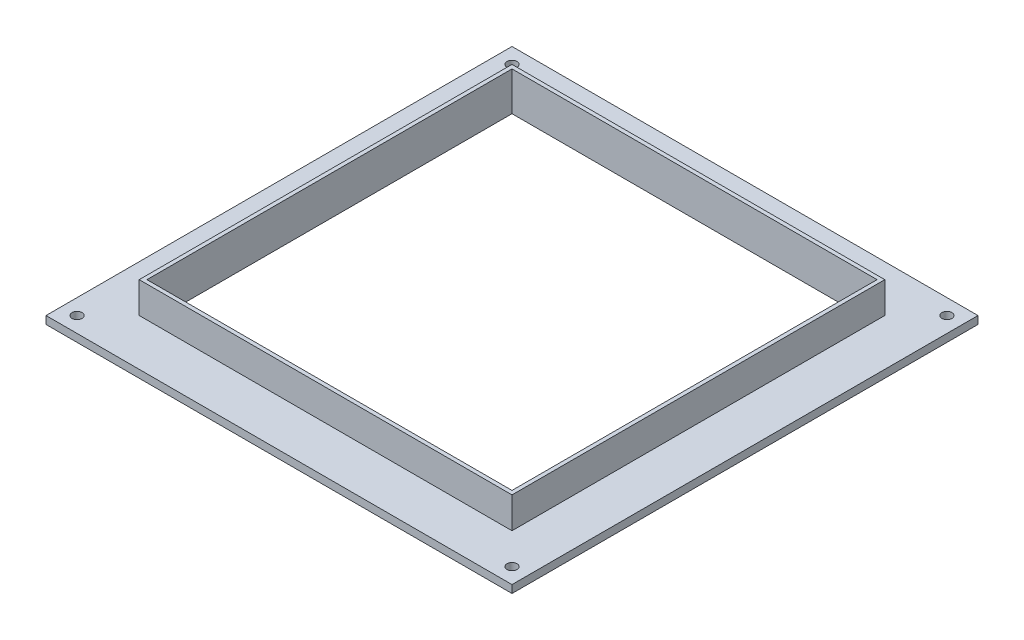
ISO-10303-21;
HEADER;
FILE_DESCRIPTION(('STEP AP214'),'2;1');
FILE_NAME('part.step','',(''),(''),'','','');
FILE_SCHEMA(('AUTOMOTIVE_DESIGN { 1 0 10303 214 1 1 1 1 }'));
ENDSEC;
DATA;
#1=APPLICATION_CONTEXT('core data for automotive mechanical design processes');
#2=APPLICATION_PROTOCOL_DEFINITION('international standard','automotive_design',2000,#1);
#3=PRODUCT_CONTEXT('',#1,'mechanical');
#4=PRODUCT('Part','Part','',(#3));
#5=PRODUCT_RELATED_PRODUCT_CATEGORY('part','',(#4));
#6=PRODUCT_DEFINITION_FORMATION('','',#4);
#7=PRODUCT_DEFINITION_CONTEXT('part definition',#1,'design');
#8=PRODUCT_DEFINITION('design','',#6,#7);
#9=PRODUCT_DEFINITION_SHAPE('','',#8);
#10=(LENGTH_UNIT() NAMED_UNIT(*) SI_UNIT(.MILLI.,.METRE.));
#11=(NAMED_UNIT(*) PLANE_ANGLE_UNIT() SI_UNIT($,.RADIAN.));
#12=(NAMED_UNIT(*) SI_UNIT($,.STERADIAN.) SOLID_ANGLE_UNIT());
#13=UNCERTAINTY_MEASURE_WITH_UNIT(LENGTH_MEASURE(1.E-05),#10,'distance_accuracy_value','');
#14=(GEOMETRIC_REPRESENTATION_CONTEXT(3) GLOBAL_UNCERTAINTY_ASSIGNED_CONTEXT((#13)) GLOBAL_UNIT_ASSIGNED_CONTEXT((#10,
#11,#12)) REPRESENTATION_CONTEXT('',''));
#15=CARTESIAN_POINT('',(0.,0.,0.));
#16=DIRECTION('',(0.,0.,1.));
#17=DIRECTION('',(1.,0.,0.));
#18=AXIS2_PLACEMENT_3D('',#15,#16,#17);
#19=CARTESIAN_POINT('',(0.,5.,-300.));
#20=DIRECTION('',(0.,0.,-1.));
#21=DIRECTION('',(-1.,0.,0.));
#22=AXIS2_PLACEMENT_3D('',#19,#20,#21);
#23=PLANE('',#22);
#24=DIRECTION('',(1.,0.,0.));
#25=VECTOR('',#24,1.);
#26=CARTESIAN_POINT('',(0.,0.,-300.));
#27=LINE('',#26,#25);
#28=CARTESIAN_POINT('',(0.,0.,-300.));
#29=VERTEX_POINT('',#28);
#30=CARTESIAN_POINT('',(300.,0.,-300.));
#31=VERTEX_POINT('',#30);
#32=EDGE_CURVE('E181',#29,#31,#27,.T.);
#33=ORIENTED_EDGE('',*,*,#32,.F.);
#34=DIRECTION('',(0.,-1.,0.));
#35=VECTOR('',#34,1.);
#36=CARTESIAN_POINT('',(0.,5.,-300.));
#37=LINE('',#36,#35);
#38=CARTESIAN_POINT('',(0.,5.,-300.));
#39=VERTEX_POINT('',#38);
#40=EDGE_CURVE('E169',#39,#29,#37,.T.);
#41=ORIENTED_EDGE('',*,*,#40,.F.);
#42=DIRECTION('',(1.,0.,0.));
#43=VECTOR('',#42,1.);
#44=CARTESIAN_POINT('',(0.,5.,-300.));
#45=LINE('',#44,#43);
#46=CARTESIAN_POINT('',(300.,5.,-300.));
#47=VERTEX_POINT('',#46);
#48=EDGE_CURVE('E204',#39,#47,#45,.T.);
#49=ORIENTED_EDGE('',*,*,#48,.T.);
#50=DIRECTION('',(0.,-1.,0.));
#51=VECTOR('',#50,1.);
#52=CARTESIAN_POINT('',(300.,5.,-300.));
#53=LINE('',#52,#51);
#54=EDGE_CURVE('E198',#47,#31,#53,.T.);
#55=ORIENTED_EDGE('',*,*,#54,.T.);
#56=EDGE_LOOP('',(#33,#41,#49,#55));
#57=FACE_BOUND('',#56,.T.);
#58=ADVANCED_FACE('F65',(#57),#23,.T.);
#59=CARTESIAN_POINT('',(0.,5.,0.));
#60=DIRECTION('',(-1.,0.,0.));
#61=DIRECTION('',(0.,0.,1.));
#62=AXIS2_PLACEMENT_3D('',#59,#60,#61);
#63=PLANE('',#62);
#64=DIRECTION('',(0.,0.,-1.));
#65=VECTOR('',#64,1.);
#66=CARTESIAN_POINT('',(0.,0.,0.));
#67=LINE('',#66,#65);
#68=CARTESIAN_POINT('',(0.,0.,0.));
#69=VERTEX_POINT('',#68);
#70=EDGE_CURVE('E207',#69,#29,#67,.T.);
#71=ORIENTED_EDGE('',*,*,#70,.F.);
#72=DIRECTION('',(0.,-1.,0.));
#73=VECTOR('',#72,1.);
#74=CARTESIAN_POINT('',(0.,5.,0.));
#75=LINE('',#74,#73);
#76=CARTESIAN_POINT('',(0.,5.,0.));
#77=VERTEX_POINT('',#76);
#78=EDGE_CURVE('E193',#77,#69,#75,.T.);
#79=ORIENTED_EDGE('',*,*,#78,.F.);
#80=DIRECTION('',(0.,0.,-1.));
#81=VECTOR('',#80,1.);
#82=CARTESIAN_POINT('',(0.,5.,0.));
#83=LINE('',#82,#81);
#84=EDGE_CURVE('E215',#77,#39,#83,.T.);
#85=ORIENTED_EDGE('',*,*,#84,.T.);
#86=ORIENTED_EDGE('',*,*,#40,.T.);
#87=EDGE_LOOP('',(#71,#79,#85,#86));
#88=FACE_BOUND('',#87,.T.);
#89=ADVANCED_FACE('F289',(#88),#63,.T.);
#90=CARTESIAN_POINT('',(0.,5.,0.));
#91=DIRECTION('',(0.,0.,-1.));
#92=DIRECTION('',(-1.,0.,0.));
#93=AXIS2_PLACEMENT_3D('',#90,#91,#92);
#94=PLANE('',#93);
#95=DIRECTION('',(1.,0.,0.));
#96=VECTOR('',#95,1.);
#97=CARTESIAN_POINT('',(0.,0.,0.));
#98=LINE('',#97,#96);
#99=CARTESIAN_POINT('',(300.,0.,0.));
#100=VERTEX_POINT('',#99);
#101=EDGE_CURVE('E205',#69,#100,#98,.T.);
#102=ORIENTED_EDGE('',*,*,#101,.T.);
#103=DIRECTION('',(0.,-1.,0.));
#104=VECTOR('',#103,1.);
#105=CARTESIAN_POINT('',(300.,5.,0.));
#106=LINE('',#105,#104);
#107=CARTESIAN_POINT('',(300.,5.,0.));
#108=VERTEX_POINT('',#107);
#109=EDGE_CURVE('E195',#108,#100,#106,.T.);
#110=ORIENTED_EDGE('',*,*,#109,.F.);
#111=DIRECTION('',(1.,0.,0.));
#112=VECTOR('',#111,1.);
#113=CARTESIAN_POINT('',(0.,5.,0.));
#114=LINE('',#113,#112);
#115=EDGE_CURVE('E213',#77,#108,#114,.T.);
#116=ORIENTED_EDGE('',*,*,#115,.F.);
#117=ORIENTED_EDGE('',*,*,#78,.T.);
#118=EDGE_LOOP('',(#102,#110,#116,#117));
#119=FACE_BOUND('',#118,.T.);
#120=ADVANCED_FACE('F294',(#119),#94,.F.);
#121=CARTESIAN_POINT('',(300.,5.,0.));
#122=DIRECTION('',(-1.,0.,0.));
#123=DIRECTION('',(0.,0.,1.));
#124=AXIS2_PLACEMENT_3D('',#121,#122,#123);
#125=PLANE('',#124);
#126=DIRECTION('',(0.,0.,-1.));
#127=VECTOR('',#126,1.);
#128=CARTESIAN_POINT('',(300.,0.,0.));
#129=LINE('',#128,#127);
#130=EDGE_CURVE('E201',#100,#31,#129,.T.);
#131=ORIENTED_EDGE('',*,*,#130,.T.);
#132=ORIENTED_EDGE('',*,*,#54,.F.);
#133=DIRECTION('',(0.,0.,-1.));
#134=VECTOR('',#133,1.);
#135=CARTESIAN_POINT('',(300.,5.,0.));
#136=LINE('',#135,#134);
#137=EDGE_CURVE('E200',#108,#47,#136,.T.);
#138=ORIENTED_EDGE('',*,*,#137,.F.);
#139=ORIENTED_EDGE('',*,*,#109,.T.);
#140=EDGE_LOOP('',(#131,#132,#138,#139));
#141=FACE_BOUND('',#140,.T.);
#142=ADVANCED_FACE('F310',(#141),#125,.F.);
#143=CARTESIAN_POINT('',(0.,0.,0.));
#144=DIRECTION('',(0.,1.,0.));
#145=DIRECTION('',(0.,0.,1.));
#146=AXIS2_PLACEMENT_3D('',#143,#144,#145);
#147=PLANE('',#146);
#148=DIRECTION('',(-1.,0.,0.));
#149=VECTOR('',#148,1.);
#150=CARTESIAN_POINT('',(0.,0.,-267.5));
#151=LINE('',#150,#149);
#152=CARTESIAN_POINT('',(267.5,0.,-267.5));
#153=VERTEX_POINT('',#152);
#154=CARTESIAN_POINT('',(32.5,0.,-267.5));
#155=VERTEX_POINT('',#154);
#156=EDGE_CURVE('E72',#153,#155,#151,.T.);
#157=ORIENTED_EDGE('',*,*,#156,.T.);
#158=DIRECTION('',(0.,0.,1.));
#159=VECTOR('',#158,1.);
#160=CARTESIAN_POINT('',(32.5,0.,0.));
#161=LINE('',#160,#159);
#162=CARTESIAN_POINT('',(32.5,0.,-32.5));
#163=VERTEX_POINT('',#162);
#164=EDGE_CURVE('E12',#155,#163,#161,.T.);
#165=ORIENTED_EDGE('',*,*,#164,.T.);
#166=DIRECTION('',(1.,0.,0.));
#167=VECTOR('',#166,1.);
#168=CARTESIAN_POINT('',(0.,0.,-32.5));
#169=LINE('',#168,#167);
#170=CARTESIAN_POINT('',(267.5,0.,-32.5));
#171=VERTEX_POINT('',#170);
#172=EDGE_CURVE('E164',#163,#171,#169,.T.);
#173=ORIENTED_EDGE('',*,*,#172,.T.);
#174=DIRECTION('',(0.,0.,-1.));
#175=VECTOR('',#174,1.);
#176=CARTESIAN_POINT('',(267.5,0.,0.));
#177=LINE('',#176,#175);
#178=EDGE_CURVE('E168',#171,#153,#177,.T.);
#179=ORIENTED_EDGE('',*,*,#178,.T.);
#180=EDGE_LOOP('',(#157,#165,#173,#179));
#181=FACE_BOUND('',#180,.T.);
#182=CARTESIAN_POINT('',(10.,0.,-290.));
#183=DIRECTION('',(0.,1.,0.));
#184=DIRECTION('',(0.,0.,1.));
#185=AXIS2_PLACEMENT_3D('',#182,#183,#184);
#186=CIRCLE('',#185,3.25);
#187=CARTESIAN_POINT('',(10.,0.,-286.75));
#188=VERTEX_POINT('',#187);
#189=EDGE_CURVE('E178',#188,#188,#186,.T.);
#190=ORIENTED_EDGE('',*,*,#189,.T.);
#191=EDGE_LOOP('',(#190));
#192=FACE_BOUND('',#191,.T.);
#193=CARTESIAN_POINT('',(290.,0.,-290.));
#194=DIRECTION('',(0.,1.,0.));
#195=DIRECTION('',(0.,0.,1.));
#196=AXIS2_PLACEMENT_3D('',#193,#194,#195);
#197=CIRCLE('',#196,3.24999999999995);
#198=CARTESIAN_POINT('',(290.,0.,-286.75));
#199=VERTEX_POINT('',#198);
#200=EDGE_CURVE('E182',#199,#199,#197,.T.);
#201=ORIENTED_EDGE('',*,*,#200,.T.);
#202=EDGE_LOOP('',(#201));
#203=FACE_BOUND('',#202,.T.);
#204=CARTESIAN_POINT('',(290.,0.,-10.));
#205=DIRECTION('',(0.,1.,0.));
#206=DIRECTION('',(0.,0.,1.));
#207=AXIS2_PLACEMENT_3D('',#204,#205,#206);
#208=CIRCLE('',#207,3.24999999999995);
#209=CARTESIAN_POINT('',(290.,0.,-6.75000000000005));
#210=VERTEX_POINT('',#209);
#211=EDGE_CURVE('E185',#210,#210,#208,.T.);
#212=ORIENTED_EDGE('',*,*,#211,.T.);
#213=EDGE_LOOP('',(#212));
#214=FACE_BOUND('',#213,.T.);
#215=CARTESIAN_POINT('',(10.,0.,-10.));
#216=DIRECTION('',(0.,1.,0.));
#217=DIRECTION('',(0.,0.,1.));
#218=AXIS2_PLACEMENT_3D('',#215,#216,#217);
#219=CIRCLE('',#218,3.25);
#220=CARTESIAN_POINT('',(10.,0.,-6.75));
#221=VERTEX_POINT('',#220);
#222=EDGE_CURVE('E188',#221,#221,#219,.T.);
#223=ORIENTED_EDGE('',*,*,#222,.T.);
#224=EDGE_LOOP('',(#223));
#225=FACE_BOUND('',#224,.T.);
#226=ORIENTED_EDGE('',*,*,#32,.T.);
#227=ORIENTED_EDGE('',*,*,#130,.F.);
#228=ORIENTED_EDGE('',*,*,#101,.F.);
#229=ORIENTED_EDGE('',*,*,#70,.T.);
#230=EDGE_LOOP('',(#226,#227,#228,#229));
#231=FACE_BOUND('',#230,.T.);
#232=ADVANCED_FACE('F171',(#181,#192,#203,#214,#225,#231),#147,.F.);
#233=CARTESIAN_POINT('',(10.,-15.,-10.));
#234=DIRECTION('',(0.,1.,0.));
#235=DIRECTION('',(0.,0.,1.));
#236=AXIS2_PLACEMENT_3D('',#233,#234,#235);
#237=CYLINDRICAL_SURFACE('',#236,3.25);
#238=CARTESIAN_POINT('',(10.,5.,-10.));
#239=DIRECTION('',(0.,1.,0.));
#240=DIRECTION('',(0.,0.,1.));
#241=AXIS2_PLACEMENT_3D('',#238,#239,#240);
#242=CIRCLE('',#241,3.25);
#243=CARTESIAN_POINT('',(10.,5.,-6.75));
#244=VERTEX_POINT('',#243);
#245=EDGE_CURVE('E191',#244,#244,#242,.T.);
#246=ORIENTED_EDGE('',*,*,#245,.T.);
#247=EDGE_LOOP('',(#246));
#248=FACE_BOUND('',#247,.T.);
#249=ORIENTED_EDGE('',*,*,#222,.F.);
#250=EDGE_LOOP('',(#249));
#251=FACE_BOUND('',#250,.T.);
#252=ADVANCED_FACE('F321',(#248,#251),#237,.F.);
#253=CARTESIAN_POINT('',(290.,-15.,-10.));
#254=DIRECTION('',(0.,1.,0.));
#255=DIRECTION('',(0.,0.,1.));
#256=AXIS2_PLACEMENT_3D('',#253,#254,#255);
#257=CYLINDRICAL_SURFACE('',#256,3.24999999999995);
#258=CARTESIAN_POINT('',(290.,5.,-10.));
#259=DIRECTION('',(0.,1.,0.));
#260=DIRECTION('',(0.,0.,1.));
#261=AXIS2_PLACEMENT_3D('',#258,#259,#260);
#262=CIRCLE('',#261,3.24999999999995);
#263=CARTESIAN_POINT('',(290.,5.,-6.75000000000005));
#264=VERTEX_POINT('',#263);
#265=EDGE_CURVE('E222',#264,#264,#262,.T.);
#266=ORIENTED_EDGE('',*,*,#265,.T.);
#267=EDGE_LOOP('',(#266));
#268=FACE_BOUND('',#267,.T.);
#269=ORIENTED_EDGE('',*,*,#211,.F.);
#270=EDGE_LOOP('',(#269));
#271=FACE_BOUND('',#270,.T.);
#272=ADVANCED_FACE('F328',(#268,#271),#257,.F.);
#273=CARTESIAN_POINT('',(290.,-15.,-290.));
#274=DIRECTION('',(0.,1.,0.));
#275=DIRECTION('',(0.,0.,1.));
#276=AXIS2_PLACEMENT_3D('',#273,#274,#275);
#277=CYLINDRICAL_SURFACE('',#276,3.24999999999995);
#278=CARTESIAN_POINT('',(290.,5.,-290.));
#279=DIRECTION('',(0.,1.,0.));
#280=DIRECTION('',(0.,0.,1.));
#281=AXIS2_PLACEMENT_3D('',#278,#279,#280);
#282=CIRCLE('',#281,3.24999999999995);
#283=CARTESIAN_POINT('',(290.,5.,-286.75));
#284=VERTEX_POINT('',#283);
#285=EDGE_CURVE('E226',#284,#284,#282,.T.);
#286=ORIENTED_EDGE('',*,*,#285,.T.);
#287=EDGE_LOOP('',(#286));
#288=FACE_BOUND('',#287,.T.);
#289=ORIENTED_EDGE('',*,*,#200,.F.);
#290=EDGE_LOOP('',(#289));
#291=FACE_BOUND('',#290,.T.);
#292=ADVANCED_FACE('F332',(#288,#291),#277,.F.);
#293=CARTESIAN_POINT('',(10.,-15.,-290.));
#294=DIRECTION('',(0.,1.,0.));
#295=DIRECTION('',(0.,0.,1.));
#296=AXIS2_PLACEMENT_3D('',#293,#294,#295);
#297=CYLINDRICAL_SURFACE('',#296,3.25);
#298=CARTESIAN_POINT('',(10.,5.,-290.));
#299=DIRECTION('',(0.,1.,0.));
#300=DIRECTION('',(0.,0.,1.));
#301=AXIS2_PLACEMENT_3D('',#298,#299,#300);
#302=CIRCLE('',#301,3.25);
#303=CARTESIAN_POINT('',(10.,5.,-286.75));
#304=VERTEX_POINT('',#303);
#305=EDGE_CURVE('E223',#304,#304,#302,.T.);
#306=ORIENTED_EDGE('',*,*,#305,.T.);
#307=EDGE_LOOP('',(#306));
#308=FACE_BOUND('',#307,.T.);
#309=ORIENTED_EDGE('',*,*,#189,.F.);
#310=EDGE_LOOP('',(#309));
#311=FACE_BOUND('',#310,.T.);
#312=ADVANCED_FACE('F325',(#308,#311),#297,.F.);
#313=CARTESIAN_POINT('',(0.,5.,0.));
#314=DIRECTION('',(0.,1.,0.));
#315=DIRECTION('',(0.,0.,1.));
#316=AXIS2_PLACEMENT_3D('',#313,#314,#315);
#317=PLANE('',#316);
#318=DIRECTION('',(0.,0.,-1.));
#319=VECTOR('',#318,1.);
#320=CARTESIAN_POINT('',(30.,5.,0.));
#321=LINE('',#320,#319);
#322=CARTESIAN_POINT('',(30.,5.,-30.));
#323=VERTEX_POINT('',#322);
#324=CARTESIAN_POINT('',(30.,5.,-270.));
#325=VERTEX_POINT('',#324);
#326=EDGE_CURVE('E253',#323,#325,#321,.T.);
#327=ORIENTED_EDGE('',*,*,#326,.T.);
#328=DIRECTION('',(1.,0.,0.));
#329=VECTOR('',#328,1.);
#330=CARTESIAN_POINT('',(0.,5.,-270.));
#331=LINE('',#330,#329);
#332=CARTESIAN_POINT('',(270.,5.,-270.));
#333=VERTEX_POINT('',#332);
#334=EDGE_CURVE('E246',#325,#333,#331,.T.);
#335=ORIENTED_EDGE('',*,*,#334,.T.);
#336=DIRECTION('',(0.,0.,-1.));
#337=VECTOR('',#336,1.);
#338=CARTESIAN_POINT('',(270.,5.,0.));
#339=LINE('',#338,#337);
#340=CARTESIAN_POINT('',(270.,5.,-30.));
#341=VERTEX_POINT('',#340);
#342=EDGE_CURVE('E249',#341,#333,#339,.T.);
#343=ORIENTED_EDGE('',*,*,#342,.F.);
#344=DIRECTION('',(1.,0.,0.));
#345=VECTOR('',#344,1.);
#346=CARTESIAN_POINT('',(0.,5.,-30.));
#347=LINE('',#346,#345);
#348=EDGE_CURVE('E87',#323,#341,#347,.T.);
#349=ORIENTED_EDGE('',*,*,#348,.F.);
#350=EDGE_LOOP('',(#327,#335,#343,#349));
#351=FACE_BOUND('',#350,.T.);
#352=ORIENTED_EDGE('',*,*,#305,.F.);
#353=EDGE_LOOP('',(#352));
#354=FACE_BOUND('',#353,.T.);
#355=ORIENTED_EDGE('',*,*,#285,.F.);
#356=EDGE_LOOP('',(#355));
#357=FACE_BOUND('',#356,.T.);
#358=ORIENTED_EDGE('',*,*,#265,.F.);
#359=EDGE_LOOP('',(#358));
#360=FACE_BOUND('',#359,.T.);
#361=ORIENTED_EDGE('',*,*,#245,.F.);
#362=EDGE_LOOP('',(#361));
#363=FACE_BOUND('',#362,.T.);
#364=ORIENTED_EDGE('',*,*,#48,.F.);
#365=ORIENTED_EDGE('',*,*,#84,.F.);
#366=ORIENTED_EDGE('',*,*,#115,.T.);
#367=ORIENTED_EDGE('',*,*,#137,.T.);
#368=EDGE_LOOP('',(#364,#365,#366,#367));
#369=FACE_BOUND('',#368,.T.);
#370=ADVANCED_FACE('F306',(#351,#354,#357,#360,#363,#369),#317,.T.);
#371=CARTESIAN_POINT('',(30.,25.,0.));
#372=DIRECTION('',(-1.,0.,0.));
#373=DIRECTION('',(0.,0.,1.));
#374=AXIS2_PLACEMENT_3D('',#371,#372,#373);
#375=PLANE('',#374);
#376=ORIENTED_EDGE('',*,*,#326,.F.);
#377=DIRECTION('',(0.,-1.,0.));
#378=VECTOR('',#377,1.);
#379=CARTESIAN_POINT('',(30.,25.,-30.));
#380=LINE('',#379,#378);
#381=CARTESIAN_POINT('',(30.,25.,-30.));
#382=VERTEX_POINT('',#381);
#383=EDGE_CURVE('E227',#382,#323,#380,.T.);
#384=ORIENTED_EDGE('',*,*,#383,.F.);
#385=DIRECTION('',(0.,0.,-1.));
#386=VECTOR('',#385,1.);
#387=CARTESIAN_POINT('',(30.,25.,0.));
#388=LINE('',#387,#386);
#389=CARTESIAN_POINT('',(30.,25.,-270.));
#390=VERTEX_POINT('',#389);
#391=EDGE_CURVE('E262',#382,#390,#388,.T.);
#392=ORIENTED_EDGE('',*,*,#391,.T.);
#393=DIRECTION('',(0.,-1.,0.));
#394=VECTOR('',#393,1.);
#395=CARTESIAN_POINT('',(30.,25.,-270.));
#396=LINE('',#395,#394);
#397=EDGE_CURVE('E160',#390,#325,#396,.T.);
#398=ORIENTED_EDGE('',*,*,#397,.T.);
#399=EDGE_LOOP('',(#376,#384,#392,#398));
#400=FACE_BOUND('',#399,.T.);
#401=ADVANCED_FACE('F324',(#400),#375,.T.);
#402=CARTESIAN_POINT('',(0.,25.,-30.));
#403=DIRECTION('',(0.,0.,-1.));
#404=DIRECTION('',(-1.,0.,0.));
#405=AXIS2_PLACEMENT_3D('',#402,#403,#404);
#406=PLANE('',#405);
#407=ORIENTED_EDGE('',*,*,#348,.T.);
#408=DIRECTION('',(0.,-1.,0.));
#409=VECTOR('',#408,1.);
#410=CARTESIAN_POINT('',(270.,25.,-30.));
#411=LINE('',#410,#409);
#412=CARTESIAN_POINT('',(270.,25.,-30.));
#413=VERTEX_POINT('',#412);
#414=EDGE_CURVE('E238',#413,#341,#411,.T.);
#415=ORIENTED_EDGE('',*,*,#414,.F.);
#416=DIRECTION('',(1.,0.,0.));
#417=VECTOR('',#416,1.);
#418=CARTESIAN_POINT('',(0.,25.,-30.));
#419=LINE('',#418,#417);
#420=EDGE_CURVE('E259',#382,#413,#419,.T.);
#421=ORIENTED_EDGE('',*,*,#420,.F.);
#422=ORIENTED_EDGE('',*,*,#383,.T.);
#423=EDGE_LOOP('',(#407,#415,#421,#422));
#424=FACE_BOUND('',#423,.T.);
#425=ADVANCED_FACE('F345',(#424),#406,.F.);
#426=CARTESIAN_POINT('',(270.,25.,0.));
#427=DIRECTION('',(-1.,0.,0.));
#428=DIRECTION('',(0.,0.,1.));
#429=AXIS2_PLACEMENT_3D('',#426,#427,#428);
#430=PLANE('',#429);
#431=ORIENTED_EDGE('',*,*,#342,.T.);
#432=DIRECTION('',(0.,-1.,0.));
#433=VECTOR('',#432,1.);
#434=CARTESIAN_POINT('',(270.,25.,-270.));
#435=LINE('',#434,#433);
#436=CARTESIAN_POINT('',(270.,25.,-270.));
#437=VERTEX_POINT('',#436);
#438=EDGE_CURVE('E241',#437,#333,#435,.T.);
#439=ORIENTED_EDGE('',*,*,#438,.F.);
#440=DIRECTION('',(0.,0.,-1.));
#441=VECTOR('',#440,1.);
#442=CARTESIAN_POINT('',(270.,25.,0.));
#443=LINE('',#442,#441);
#444=EDGE_CURVE('E257',#413,#437,#443,.T.);
#445=ORIENTED_EDGE('',*,*,#444,.F.);
#446=ORIENTED_EDGE('',*,*,#414,.T.);
#447=EDGE_LOOP('',(#431,#439,#445,#446));
#448=FACE_BOUND('',#447,.T.);
#449=ADVANCED_FACE('F341',(#448),#430,.F.);
#450=CARTESIAN_POINT('',(0.,25.,-32.5));
#451=DIRECTION('',(0.,0.,-1.));
#452=DIRECTION('',(-1.,0.,0.));
#453=AXIS2_PLACEMENT_3D('',#450,#451,#452);
#454=PLANE('',#453);
#455=DIRECTION('',(0.,-1.,0.));
#456=VECTOR('',#455,1.);
#457=CARTESIAN_POINT('',(267.5,25.,-32.5));
#458=LINE('',#457,#456);
#459=CARTESIAN_POINT('',(267.5,25.,-32.5));
#460=VERTEX_POINT('',#459);
#461=EDGE_CURVE('E79',#460,#171,#458,.T.);
#462=ORIENTED_EDGE('',*,*,#461,.T.);
#463=ORIENTED_EDGE('',*,*,#172,.F.);
#464=DIRECTION('',(0.,-1.,0.));
#465=VECTOR('',#464,1.);
#466=CARTESIAN_POINT('',(32.5,25.,-32.5));
#467=LINE('',#466,#465);
#468=CARTESIAN_POINT('',(32.5,25.,-32.5));
#469=VERTEX_POINT('',#468);
#470=EDGE_CURVE('E154',#469,#163,#467,.T.);
#471=ORIENTED_EDGE('',*,*,#470,.F.);
#472=DIRECTION('',(1.,0.,0.));
#473=VECTOR('',#472,1.);
#474=CARTESIAN_POINT('',(0.,25.,-32.5));
#475=LINE('',#474,#473);
#476=EDGE_CURVE('E248',#469,#460,#475,.T.);
#477=ORIENTED_EDGE('',*,*,#476,.T.);
#478=EDGE_LOOP('',(#462,#463,#471,#477));
#479=FACE_BOUND('',#478,.T.);
#480=ADVANCED_FACE('F165',(#479),#454,.T.);
#481=CARTESIAN_POINT('',(32.5,25.,0.));
#482=DIRECTION('',(-1.,0.,0.));
#483=DIRECTION('',(0.,0.,1.));
#484=AXIS2_PLACEMENT_3D('',#481,#482,#483);
#485=PLANE('',#484);
#486=ORIENTED_EDGE('',*,*,#470,.T.);
#487=ORIENTED_EDGE('',*,*,#164,.F.);
#488=DIRECTION('',(0.,-1.,0.));
#489=VECTOR('',#488,1.);
#490=CARTESIAN_POINT('',(32.5,25.,-267.5));
#491=LINE('',#490,#489);
#492=CARTESIAN_POINT('',(32.5,25.,-267.5));
#493=VERTEX_POINT('',#492);
#494=EDGE_CURVE('E161',#493,#155,#491,.T.);
#495=ORIENTED_EDGE('',*,*,#494,.F.);
#496=DIRECTION('',(0.,0.,-1.));
#497=VECTOR('',#496,1.);
#498=CARTESIAN_POINT('',(32.5,25.,0.));
#499=LINE('',#498,#497);
#500=EDGE_CURVE('E158',#469,#493,#499,.T.);
#501=ORIENTED_EDGE('',*,*,#500,.F.);
#502=EDGE_LOOP('',(#486,#487,#495,#501));
#503=FACE_BOUND('',#502,.T.);
#504=ADVANCED_FACE('F155',(#503),#485,.F.);
#505=CARTESIAN_POINT('',(0.,25.,-267.5));
#506=DIRECTION('',(0.,0.,-1.));
#507=DIRECTION('',(-1.,0.,0.));
#508=AXIS2_PLACEMENT_3D('',#505,#506,#507);
#509=PLANE('',#508);
#510=ORIENTED_EDGE('',*,*,#494,.T.);
#511=ORIENTED_EDGE('',*,*,#156,.F.);
#512=DIRECTION('',(0.,-1.,0.));
#513=VECTOR('',#512,1.);
#514=CARTESIAN_POINT('',(267.5,25.,-267.5));
#515=LINE('',#514,#513);
#516=CARTESIAN_POINT('',(267.5,25.,-267.5));
#517=VERTEX_POINT('',#516);
#518=EDGE_CURVE('E233',#517,#153,#515,.T.);
#519=ORIENTED_EDGE('',*,*,#518,.F.);
#520=DIRECTION('',(1.,0.,0.));
#521=VECTOR('',#520,1.);
#522=CARTESIAN_POINT('',(0.,25.,-267.5));
#523=LINE('',#522,#521);
#524=EDGE_CURVE('E268',#493,#517,#523,.T.);
#525=ORIENTED_EDGE('',*,*,#524,.F.);
#526=EDGE_LOOP('',(#510,#511,#519,#525));
#527=FACE_BOUND('',#526,.T.);
#528=ADVANCED_FACE('F278',(#527),#509,.F.);
#529=CARTESIAN_POINT('',(267.5,25.,0.));
#530=DIRECTION('',(-1.,0.,0.));
#531=DIRECTION('',(0.,0.,1.));
#532=AXIS2_PLACEMENT_3D('',#529,#530,#531);
#533=PLANE('',#532);
#534=ORIENTED_EDGE('',*,*,#518,.T.);
#535=ORIENTED_EDGE('',*,*,#178,.F.);
#536=ORIENTED_EDGE('',*,*,#461,.F.);
#537=DIRECTION('',(0.,0.,-1.));
#538=VECTOR('',#537,1.);
#539=CARTESIAN_POINT('',(267.5,25.,0.));
#540=LINE('',#539,#538);
#541=EDGE_CURVE('E265',#460,#517,#540,.T.);
#542=ORIENTED_EDGE('',*,*,#541,.T.);
#543=EDGE_LOOP('',(#534,#535,#536,#542));
#544=FACE_BOUND('',#543,.T.);
#545=ADVANCED_FACE('F277',(#544),#533,.T.);
#546=CARTESIAN_POINT('',(0.,25.,-270.));
#547=DIRECTION('',(0.,0.,-1.));
#548=DIRECTION('',(-1.,0.,0.));
#549=AXIS2_PLACEMENT_3D('',#546,#547,#548);
#550=PLANE('',#549);
#551=ORIENTED_EDGE('',*,*,#334,.F.);
#552=ORIENTED_EDGE('',*,*,#397,.F.);
#553=DIRECTION('',(1.,0.,0.));
#554=VECTOR('',#553,1.);
#555=CARTESIAN_POINT('',(0.,25.,-270.));
#556=LINE('',#555,#554);
#557=EDGE_CURVE('E236',#390,#437,#556,.T.);
#558=ORIENTED_EDGE('',*,*,#557,.T.);
#559=ORIENTED_EDGE('',*,*,#438,.T.);
#560=EDGE_LOOP('',(#551,#552,#558,#559));
#561=FACE_BOUND('',#560,.T.);
#562=ADVANCED_FACE('F285',(#561),#550,.T.);
#563=CARTESIAN_POINT('',(0.,25.,0.));
#564=DIRECTION('',(0.,1.,0.));
#565=DIRECTION('',(0.,0.,1.));
#566=AXIS2_PLACEMENT_3D('',#563,#564,#565);
#567=PLANE('',#566);
#568=ORIENTED_EDGE('',*,*,#476,.F.);
#569=ORIENTED_EDGE('',*,*,#500,.T.);
#570=ORIENTED_EDGE('',*,*,#524,.T.);
#571=ORIENTED_EDGE('',*,*,#541,.F.);
#572=EDGE_LOOP('',(#568,#569,#570,#571));
#573=FACE_BOUND('',#572,.T.);
#574=ORIENTED_EDGE('',*,*,#391,.F.);
#575=ORIENTED_EDGE('',*,*,#420,.T.);
#576=ORIENTED_EDGE('',*,*,#444,.T.);
#577=ORIENTED_EDGE('',*,*,#557,.F.);
#578=EDGE_LOOP('',(#574,#575,#576,#577));
#579=FACE_BOUND('',#578,.T.);
#580=ADVANCED_FACE('F273',(#573,#579),#567,.T.);
#581=CLOSED_SHELL('',(#58,#89,#120,#142,#232,#252,#272,#292,#312,#370,#401,#425,#449,#480,#504,
#528,#545,#562,#580));
#582=MANIFOLD_SOLID_BREP('B2',#581);
#583=ADVANCED_BREP_SHAPE_REPRESENTATION('',(#18,#582),#14);
#584=SHAPE_DEFINITION_REPRESENTATION(#9,#583);
ENDSEC;
END-ISO-10303-21;
